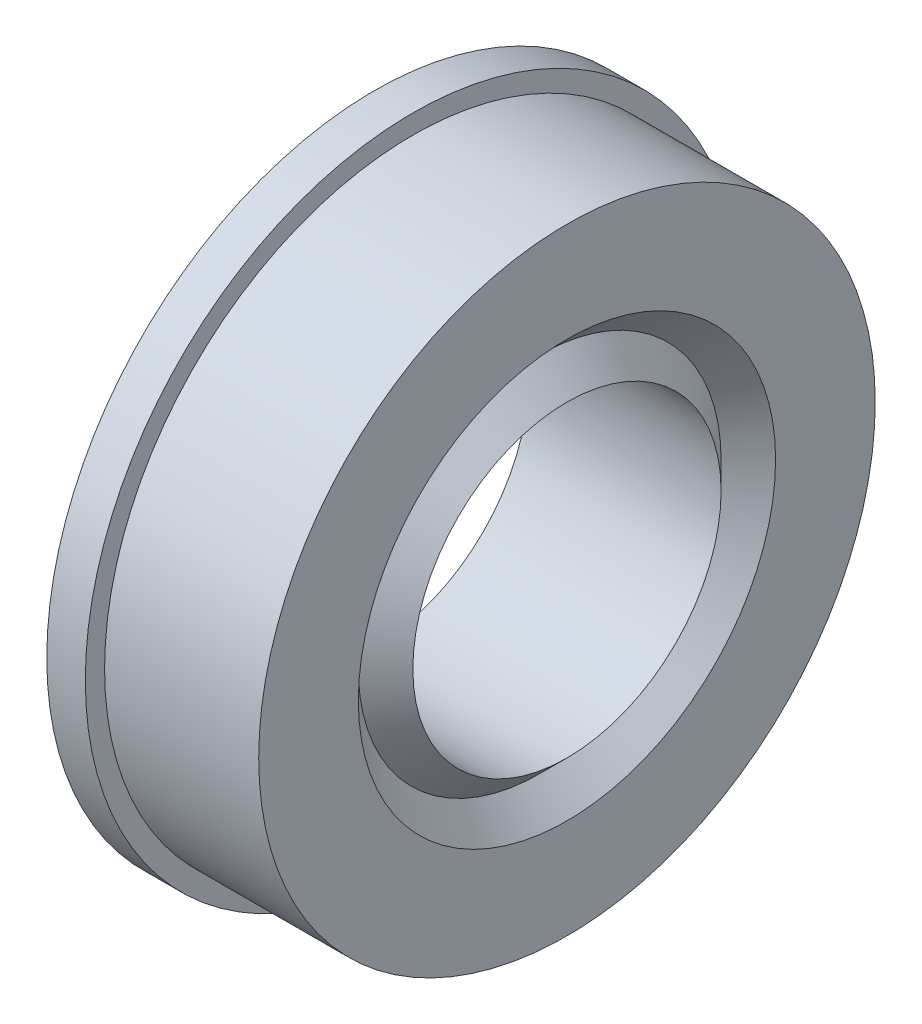
ISO-10303-21;
HEADER;
FILE_DESCRIPTION(('STEP AP214'),'2;1');
FILE_NAME('part.step','',(''),(''),'','','');
FILE_SCHEMA(('AUTOMOTIVE_DESIGN { 1 0 10303 214 1 1 1 1 }'));
ENDSEC;
DATA;
#1=APPLICATION_CONTEXT('core data for automotive mechanical design processes');
#2=APPLICATION_PROTOCOL_DEFINITION('international standard','automotive_design',2000,#1);
#3=PRODUCT_CONTEXT('',#1,'mechanical');
#4=PRODUCT('Part','Part','',(#3));
#5=PRODUCT_RELATED_PRODUCT_CATEGORY('part','',(#4));
#6=PRODUCT_DEFINITION_FORMATION('','',#4);
#7=PRODUCT_DEFINITION_CONTEXT('part definition',#1,'design');
#8=PRODUCT_DEFINITION('design','',#6,#7);
#9=PRODUCT_DEFINITION_SHAPE('','',#8);
#10=(LENGTH_UNIT() NAMED_UNIT(*) SI_UNIT(.MILLI.,.METRE.));
#11=(NAMED_UNIT(*) PLANE_ANGLE_UNIT() SI_UNIT($,.RADIAN.));
#12=(NAMED_UNIT(*) SI_UNIT($,.STERADIAN.) SOLID_ANGLE_UNIT());
#13=UNCERTAINTY_MEASURE_WITH_UNIT(LENGTH_MEASURE(1.E-05),#10,'distance_accuracy_value','');
#14=(GEOMETRIC_REPRESENTATION_CONTEXT(3) GLOBAL_UNCERTAINTY_ASSIGNED_CONTEXT((#13)) GLOBAL_UNIT_ASSIGNED_CONTEXT((#10,
#11,#12)) REPRESENTATION_CONTEXT('',''));
#15=CARTESIAN_POINT('',(0.,0.,0.));
#16=DIRECTION('',(0.,0.,1.));
#17=DIRECTION('',(1.,0.,0.));
#18=AXIS2_PLACEMENT_3D('',#15,#16,#17);
#19=CARTESIAN_POINT('',(-4.,0.,0.));
#20=DIRECTION('',(-1.,0.,0.));
#21=DIRECTION('',(0.,0.,1.));
#22=AXIS2_PLACEMENT_3D('',#19,#20,#21);
#23=CYLINDRICAL_SURFACE('',#22,8.5);
#24=CARTESIAN_POINT('',(-4.,0.,0.));
#25=DIRECTION('',(-1.,0.,0.));
#26=DIRECTION('',(0.,0.,1.));
#27=AXIS2_PLACEMENT_3D('',#24,#25,#26);
#28=CIRCLE('',#27,8.5);
#29=CARTESIAN_POINT('',(-4.,0.,8.5));
#30=VERTEX_POINT('',#29);
#31=EDGE_CURVE('E11',#30,#30,#28,.T.);
#32=ORIENTED_EDGE('',*,*,#31,.T.);
#33=EDGE_LOOP('',(#32));
#34=FACE_BOUND('',#33,.T.);
#35=CARTESIAN_POINT('',(-5.,0.,0.));
#36=DIRECTION('',(-1.,0.,0.));
#37=DIRECTION('',(0.,0.,1.));
#38=AXIS2_PLACEMENT_3D('',#35,#36,#37);
#39=CIRCLE('',#38,8.5);
#40=CARTESIAN_POINT('',(-5.,0.,8.5));
#41=VERTEX_POINT('',#40);
#42=EDGE_CURVE('E48',#41,#41,#39,.T.);
#43=ORIENTED_EDGE('',*,*,#42,.F.);
#44=EDGE_LOOP('',(#43));
#45=FACE_BOUND('',#44,.T.);
#46=ADVANCED_FACE('F45',(#34,#45),#23,.T.);
#47=CARTESIAN_POINT('',(-4.,0.,0.));
#48=DIRECTION('',(-1.,0.,0.));
#49=DIRECTION('',(0.,0.,1.));
#50=AXIS2_PLACEMENT_3D('',#47,#48,#49);
#51=PLANE('',#50);
#52=CARTESIAN_POINT('',(-4.,0.,0.));
#53=DIRECTION('',(-1.,0.,0.));
#54=DIRECTION('',(0.,0.,1.));
#55=AXIS2_PLACEMENT_3D('',#52,#53,#54);
#56=CIRCLE('',#55,8.);
#57=CARTESIAN_POINT('',(-4.,0.,8.));
#58=VERTEX_POINT('',#57);
#59=EDGE_CURVE('E55',#58,#58,#56,.T.);
#60=ORIENTED_EDGE('',*,*,#59,.T.);
#61=EDGE_LOOP('',(#60));
#62=FACE_BOUND('',#61,.T.);
#63=ORIENTED_EDGE('',*,*,#31,.F.);
#64=EDGE_LOOP('',(#63));
#65=FACE_BOUND('',#64,.T.);
#66=ADVANCED_FACE('F63',(#62,#65),#51,.F.);
#67=CARTESIAN_POINT('',(-5.,0.,0.));
#68=DIRECTION('',(-1.,0.,0.));
#69=DIRECTION('',(0.,0.,1.));
#70=AXIS2_PLACEMENT_3D('',#67,#68,#69);
#71=PLANE('',#70);
#72=CARTESIAN_POINT('',(-5.,0.,0.));
#73=DIRECTION('',(-1.,0.,0.));
#74=DIRECTION('',(0.,0.,1.));
#75=AXIS2_PLACEMENT_3D('',#72,#73,#74);
#76=CIRCLE('',#75,8.);
#77=CARTESIAN_POINT('',(-5.,0.,8.));
#78=VERTEX_POINT('',#77);
#79=EDGE_CURVE('E57',#78,#78,#76,.T.);
#80=ORIENTED_EDGE('',*,*,#79,.F.);
#81=EDGE_LOOP('',(#80));
#82=FACE_BOUND('',#81,.T.);
#83=ORIENTED_EDGE('',*,*,#42,.T.);
#84=EDGE_LOOP('',(#83));
#85=FACE_BOUND('',#84,.T.);
#86=ADVANCED_FACE('F69',(#82,#85),#71,.T.);
#87=CARTESIAN_POINT('',(-4.,0.,0.));
#88=DIRECTION('',(-1.,0.,0.));
#89=DIRECTION('',(0.,0.,1.));
#90=AXIS2_PLACEMENT_3D('',#87,#88,#89);
#91=CYLINDRICAL_SURFACE('',#90,8.);
#92=ORIENTED_EDGE('',*,*,#59,.F.);
#93=EDGE_LOOP('',(#92));
#94=FACE_BOUND('',#93,.T.);
#95=ORIENTED_EDGE('',*,*,#79,.T.);
#96=EDGE_LOOP('',(#95));
#97=FACE_BOUND('',#96,.T.);
#98=ADVANCED_FACE('F66',(#94,#97),#91,.F.);
#99=CLOSED_SHELL('',(#46,#66,#86,#98));
#100=MANIFOLD_SOLID_BREP('B2',#99);
#101=CARTESIAN_POINT('',(0.,0.,0.));
#102=DIRECTION('',(1.,0.,0.));
#103=DIRECTION('',(0.,0.,-1.));
#104=AXIS2_PLACEMENT_3D('',#101,#102,#103);
#105=CONICAL_SURFACE('',#104,5.41421356237309,0.785398163397443);
#106=CARTESIAN_POINT('',(-0.707106781186553,0.,0.));
#107=DIRECTION('',(1.,0.,0.));
#108=DIRECTION('',(0.,0.,-1.));
#109=AXIS2_PLACEMENT_3D('',#106,#107,#108);
#110=CIRCLE('',#109,4.70710678118655);
#111=CARTESIAN_POINT('',(-0.707106781186554,0.,-4.70710678118655));
#112=VERTEX_POINT('',#111);
#113=EDGE_CURVE('E44',#112,#112,#110,.T.);
#114=ORIENTED_EDGE('',*,*,#113,.F.);
#115=EDGE_LOOP('',(#114));
#116=FACE_BOUND('',#115,.T.);
#117=CARTESIAN_POINT('',(0.,0.,0.));
#118=DIRECTION('',(1.,0.,0.));
#119=DIRECTION('',(0.,0.,-1.));
#120=AXIS2_PLACEMENT_3D('',#117,#118,#119);
#121=CIRCLE('',#120,5.41421356237309);
#122=CARTESIAN_POINT('',(0.,0.,-5.41421356237309));
#123=VERTEX_POINT('',#122);
#124=EDGE_CURVE('E141',#123,#123,#121,.T.);
#125=ORIENTED_EDGE('',*,*,#124,.T.);
#126=EDGE_LOOP('',(#125));
#127=FACE_BOUND('',#126,.T.);
#128=ADVANCED_FACE('F107',(#116,#127),#105,.F.);
#129=CARTESIAN_POINT('',(-0.707106781186553,0.,0.));
#130=DIRECTION('',(-1.,0.,0.));
#131=DIRECTION('',(0.,0.,1.));
#132=AXIS2_PLACEMENT_3D('',#129,#130,#131);
#133=CONICAL_SURFACE('',#132,4.70710678118655,0.785398163397447);
#134=CARTESIAN_POINT('',(0.,0.,0.));
#135=DIRECTION('',(1.,0.,0.));
#136=DIRECTION('',(0.,0.,-1.));
#137=AXIS2_PLACEMENT_3D('',#134,#135,#136);
#138=CIRCLE('',#137,4.);
#139=CARTESIAN_POINT('',(0.,0.,-4.));
#140=VERTEX_POINT('',#139);
#141=EDGE_CURVE('E113',#140,#140,#138,.T.);
#142=ORIENTED_EDGE('',*,*,#141,.F.);
#143=EDGE_LOOP('',(#142));
#144=FACE_BOUND('',#143,.T.);
#145=ORIENTED_EDGE('',*,*,#113,.T.);
#146=EDGE_LOOP('',(#145));
#147=FACE_BOUND('',#146,.T.);
#148=ADVANCED_FACE('F158',(#144,#147),#133,.T.);
#149=CARTESIAN_POINT('',(0.,0.,0.));
#150=DIRECTION('',(1.,0.,0.));
#151=DIRECTION('',(0.,0.,-1.));
#152=AXIS2_PLACEMENT_3D('',#149,#150,#151);
#153=CYLINDRICAL_SURFACE('',#152,4.);
#154=ORIENTED_EDGE('',*,*,#141,.T.);
#155=EDGE_LOOP('',(#154));
#156=FACE_BOUND('',#155,.T.);
#157=CARTESIAN_POINT('',(-5.,0.,0.));
#158=DIRECTION('',(1.,0.,0.));
#159=DIRECTION('',(0.,0.,-1.));
#160=AXIS2_PLACEMENT_3D('',#157,#158,#159);
#161=CIRCLE('',#160,4.);
#162=CARTESIAN_POINT('',(-5.,0.,-4.));
#163=VERTEX_POINT('',#162);
#164=EDGE_CURVE('E117',#163,#163,#161,.T.);
#165=ORIENTED_EDGE('',*,*,#164,.F.);
#166=EDGE_LOOP('',(#165));
#167=FACE_BOUND('',#166,.T.);
#168=ADVANCED_FACE('F163',(#156,#167),#153,.F.);
#169=CARTESIAN_POINT('',(-4.29289321881345,0.,0.));
#170=DIRECTION('',(1.,0.,0.));
#171=DIRECTION('',(0.,0.,-1.));
#172=AXIS2_PLACEMENT_3D('',#169,#170,#171);
#173=CONICAL_SURFACE('',#172,4.70710678118655,0.785398163397445);
#174=ORIENTED_EDGE('',*,*,#164,.T.);
#175=EDGE_LOOP('',(#174));
#176=FACE_BOUND('',#175,.T.);
#177=CARTESIAN_POINT('',(-4.29289321881345,0.,0.));
#178=DIRECTION('',(1.,0.,0.));
#179=DIRECTION('',(0.,0.,-1.));
#180=AXIS2_PLACEMENT_3D('',#177,#178,#179);
#181=CIRCLE('',#180,4.70710678118655);
#182=CARTESIAN_POINT('',(-4.29289321881345,0.,-4.70710678118654));
#183=VERTEX_POINT('',#182);
#184=EDGE_CURVE('E121',#183,#183,#181,.T.);
#185=ORIENTED_EDGE('',*,*,#184,.F.);
#186=EDGE_LOOP('',(#185));
#187=FACE_BOUND('',#186,.T.);
#188=ADVANCED_FACE('F168',(#176,#187),#173,.T.);
#189=CARTESIAN_POINT('',(-5.,0.,0.));
#190=DIRECTION('',(-1.,0.,0.));
#191=DIRECTION('',(0.,0.,1.));
#192=AXIS2_PLACEMENT_3D('',#189,#190,#191);
#193=CONICAL_SURFACE('',#192,5.41421356237309,0.785398163397448);
#194=ORIENTED_EDGE('',*,*,#184,.T.);
#195=EDGE_LOOP('',(#194));
#196=FACE_BOUND('',#195,.T.);
#197=CARTESIAN_POINT('',(-5.,0.,0.));
#198=DIRECTION('',(1.,0.,0.));
#199=DIRECTION('',(0.,0.,-1.));
#200=AXIS2_PLACEMENT_3D('',#197,#198,#199);
#201=CIRCLE('',#200,5.41421356237309);
#202=CARTESIAN_POINT('',(-5.,0.,-5.41421356237309));
#203=VERTEX_POINT('',#202);
#204=EDGE_CURVE('E126',#203,#203,#201,.T.);
#205=ORIENTED_EDGE('',*,*,#204,.F.);
#206=EDGE_LOOP('',(#205));
#207=FACE_BOUND('',#206,.T.);
#208=ADVANCED_FACE('F173',(#196,#207),#193,.F.);
#209=CARTESIAN_POINT('',(-5.,0.,0.));
#210=DIRECTION('',(1.,0.,0.));
#211=DIRECTION('',(0.,0.,-1.));
#212=AXIS2_PLACEMENT_3D('',#209,#210,#211);
#213=PLANE('',#212);
#214=CARTESIAN_POINT('',(-5.,0.,0.));
#215=DIRECTION('',(1.,0.,0.));
#216=DIRECTION('',(0.,0.,-1.));
#217=AXIS2_PLACEMENT_3D('',#214,#215,#216);
#218=CIRCLE('',#217,6.5857864376269);
#219=CARTESIAN_POINT('',(-5.,0.,-6.5857864376269));
#220=VERTEX_POINT('',#219);
#221=EDGE_CURVE('E129',#220,#220,#218,.T.);
#222=ORIENTED_EDGE('',*,*,#221,.F.);
#223=EDGE_LOOP('',(#222));
#224=FACE_BOUND('',#223,.T.);
#225=ORIENTED_EDGE('',*,*,#204,.T.);
#226=EDGE_LOOP('',(#225));
#227=FACE_BOUND('',#226,.T.);
#228=ADVANCED_FACE('F177',(#224,#227),#213,.F.);
#229=CARTESIAN_POINT('',(-4.29289321881345,0.,0.));
#230=DIRECTION('',(1.,0.,0.));
#231=DIRECTION('',(0.,0.,-1.));
#232=AXIS2_PLACEMENT_3D('',#229,#230,#231);
#233=CONICAL_SURFACE('',#232,7.29289321881345,0.78539816339745);
#234=ORIENTED_EDGE('',*,*,#221,.T.);
#235=EDGE_LOOP('',(#234));
#236=FACE_BOUND('',#235,.T.);
#237=CARTESIAN_POINT('',(-4.29289321881345,0.,0.));
#238=DIRECTION('',(1.,0.,0.));
#239=DIRECTION('',(0.,0.,-1.));
#240=AXIS2_PLACEMENT_3D('',#237,#238,#239);
#241=CIRCLE('',#240,7.29289321881345);
#242=CARTESIAN_POINT('',(-4.29289321881345,0.,-7.29289321881345));
#243=VERTEX_POINT('',#242);
#244=EDGE_CURVE('E132',#243,#243,#241,.T.);
#245=ORIENTED_EDGE('',*,*,#244,.F.);
#246=EDGE_LOOP('',(#245));
#247=FACE_BOUND('',#246,.T.);
#248=ADVANCED_FACE('F181',(#236,#247),#233,.T.);
#249=CARTESIAN_POINT('',(-5.,0.,0.));
#250=DIRECTION('',(-1.,0.,0.));
#251=DIRECTION('',(0.,0.,1.));
#252=AXIS2_PLACEMENT_3D('',#249,#250,#251);
#253=CONICAL_SURFACE('',#252,8.,0.785398163397447);
#254=ORIENTED_EDGE('',*,*,#244,.T.);
#255=EDGE_LOOP('',(#254));
#256=FACE_BOUND('',#255,.T.);
#257=CARTESIAN_POINT('',(-5.,0.,0.));
#258=DIRECTION('',(1.,0.,0.));
#259=DIRECTION('',(0.,0.,-1.));
#260=AXIS2_PLACEMENT_3D('',#257,#258,#259);
#261=CIRCLE('',#260,8.);
#262=CARTESIAN_POINT('',(-5.,0.,-8.));
#263=VERTEX_POINT('',#262);
#264=EDGE_CURVE('E135',#263,#263,#261,.T.);
#265=ORIENTED_EDGE('',*,*,#264,.F.);
#266=EDGE_LOOP('',(#265));
#267=FACE_BOUND('',#266,.T.);
#268=ADVANCED_FACE('F154',(#256,#267),#253,.F.);
#269=CARTESIAN_POINT('',(0.,0.,0.));
#270=DIRECTION('',(1.,0.,0.));
#271=DIRECTION('',(0.,0.,-1.));
#272=AXIS2_PLACEMENT_3D('',#269,#270,#271);
#273=CYLINDRICAL_SURFACE('',#272,8.);
#274=ORIENTED_EDGE('',*,*,#264,.T.);
#275=EDGE_LOOP('',(#274));
#276=FACE_BOUND('',#275,.T.);
#277=CARTESIAN_POINT('',(0.,0.,0.));
#278=DIRECTION('',(1.,0.,0.));
#279=DIRECTION('',(0.,0.,-1.));
#280=AXIS2_PLACEMENT_3D('',#277,#278,#279);
#281=CIRCLE('',#280,8.);
#282=CARTESIAN_POINT('',(0.,0.,-8.));
#283=VERTEX_POINT('',#282);
#284=EDGE_CURVE('E138',#283,#283,#281,.T.);
#285=ORIENTED_EDGE('',*,*,#284,.F.);
#286=EDGE_LOOP('',(#285));
#287=FACE_BOUND('',#286,.T.);
#288=ADVANCED_FACE('F148',(#276,#287),#273,.T.);
#289=CARTESIAN_POINT('',(0.,0.,0.));
#290=DIRECTION('',(1.,0.,0.));
#291=DIRECTION('',(0.,0.,-1.));
#292=AXIS2_PLACEMENT_3D('',#289,#290,#291);
#293=PLANE('',#292);
#294=ORIENTED_EDGE('',*,*,#284,.T.);
#295=EDGE_LOOP('',(#294));
#296=FACE_BOUND('',#295,.T.);
#297=ORIENTED_EDGE('',*,*,#124,.F.);
#298=EDGE_LOOP('',(#297));
#299=FACE_BOUND('',#298,.T.);
#300=ADVANCED_FACE('F146',(#296,#299),#293,.T.);
#301=CLOSED_SHELL('',(#128,#148,#168,#188,#208,#228,#248,#268,#288,#300));
#302=MANIFOLD_SOLID_BREP('B6',#301);
#303=ADVANCED_BREP_SHAPE_REPRESENTATION('',(#18,#100,#302),#14);
#304=SHAPE_DEFINITION_REPRESENTATION(#9,#303);
ENDSEC;
END-ISO-10303-21;
